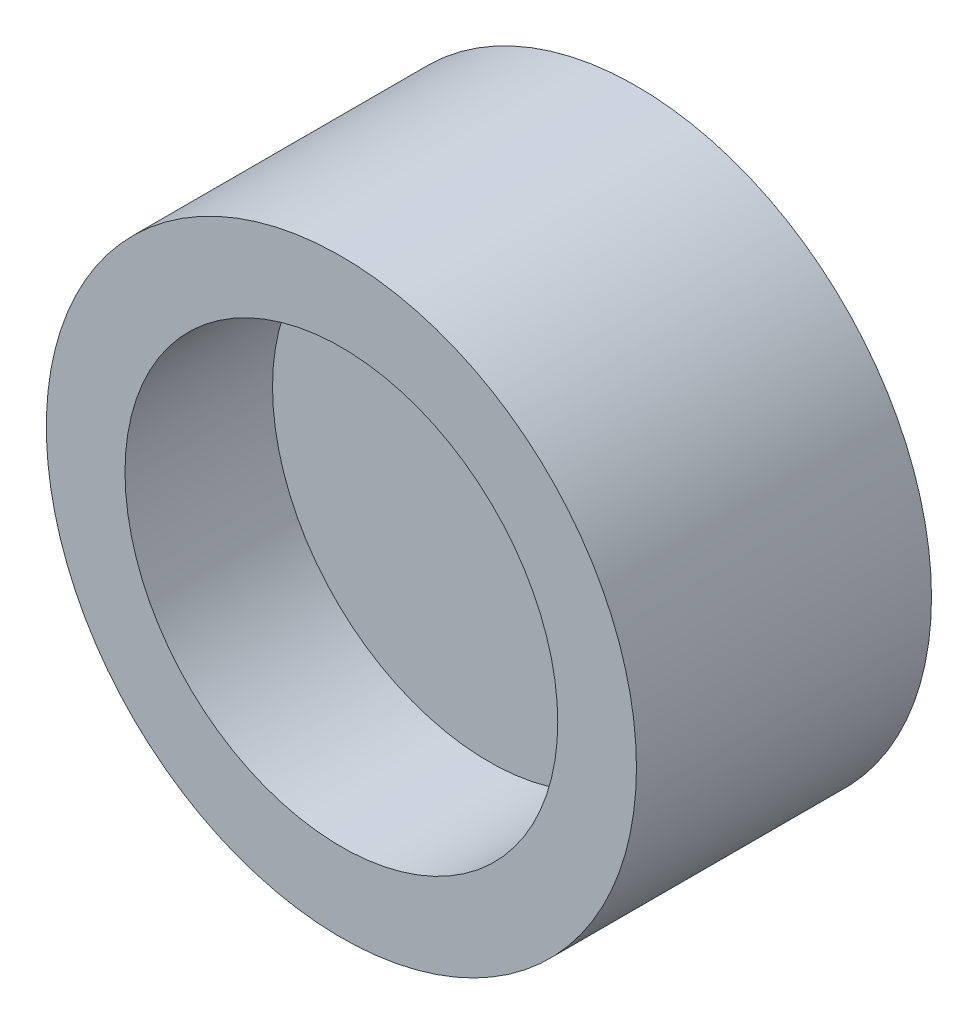
ISO-10303-21;
HEADER;
FILE_DESCRIPTION(('STEP AP214'),'2;1');
FILE_NAME('part.step','',(''),(''),'','','');
FILE_SCHEMA(('AUTOMOTIVE_DESIGN { 1 0 10303 214 1 1 1 1 }'));
ENDSEC;
DATA;
#1=APPLICATION_CONTEXT('core data for automotive mechanical design processes');
#2=APPLICATION_PROTOCOL_DEFINITION('international standard','automotive_design',2000,#1);
#3=PRODUCT_CONTEXT('',#1,'mechanical');
#4=PRODUCT('Part','Part','',(#3));
#5=PRODUCT_RELATED_PRODUCT_CATEGORY('part','',(#4));
#6=PRODUCT_DEFINITION_FORMATION('','',#4);
#7=PRODUCT_DEFINITION_CONTEXT('part definition',#1,'design');
#8=PRODUCT_DEFINITION('design','',#6,#7);
#9=PRODUCT_DEFINITION_SHAPE('','',#8);
#10=(LENGTH_UNIT() NAMED_UNIT(*) SI_UNIT(.MILLI.,.METRE.));
#11=(NAMED_UNIT(*) PLANE_ANGLE_UNIT() SI_UNIT($,.RADIAN.));
#12=(NAMED_UNIT(*) SI_UNIT($,.STERADIAN.) SOLID_ANGLE_UNIT());
#13=UNCERTAINTY_MEASURE_WITH_UNIT(LENGTH_MEASURE(1.E-05),#10,'distance_accuracy_value','');
#14=(GEOMETRIC_REPRESENTATION_CONTEXT(3) GLOBAL_UNCERTAINTY_ASSIGNED_CONTEXT((#13)) GLOBAL_UNIT_ASSIGNED_CONTEXT((#10,
#11,#12)) REPRESENTATION_CONTEXT('',''));
#15=CARTESIAN_POINT('',(0.,0.,0.));
#16=DIRECTION('',(0.,0.,1.));
#17=DIRECTION('',(1.,0.,0.));
#18=AXIS2_PLACEMENT_3D('',#15,#16,#17);
#19=CARTESIAN_POINT('',(0.,0.,3.));
#20=DIRECTION('',(0.,0.,-1.));
#21=DIRECTION('',(-1.,0.,0.));
#22=AXIS2_PLACEMENT_3D('',#19,#20,#21);
#23=CYLINDRICAL_SURFACE('',#22,3.);
#24=CARTESIAN_POINT('',(0.,0.,3.));
#25=DIRECTION('',(0.,0.,1.));
#26=DIRECTION('',(1.,0.,0.));
#27=AXIS2_PLACEMENT_3D('',#24,#25,#26);
#28=CIRCLE('',#27,3.);
#29=CARTESIAN_POINT('',(3.,0.,3.));
#30=VERTEX_POINT('',#29);
#31=EDGE_CURVE('E10',#30,#30,#28,.T.);
#32=ORIENTED_EDGE('',*,*,#31,.F.);
#33=EDGE_LOOP('',(#32));
#34=FACE_BOUND('',#33,.T.);
#35=CARTESIAN_POINT('',(0.,0.,0.));
#36=DIRECTION('',(0.,0.,1.));
#37=DIRECTION('',(1.,0.,0.));
#38=AXIS2_PLACEMENT_3D('',#35,#36,#37);
#39=CIRCLE('',#38,3.);
#40=CARTESIAN_POINT('',(3.,0.,0.));
#41=VERTEX_POINT('',#40);
#42=EDGE_CURVE('E40',#41,#41,#39,.T.);
#43=ORIENTED_EDGE('',*,*,#42,.T.);
#44=EDGE_LOOP('',(#43));
#45=FACE_BOUND('',#44,.T.);
#46=ADVANCED_FACE('F37',(#34,#45),#23,.T.);
#47=CARTESIAN_POINT('',(0.,0.,3.));
#48=DIRECTION('',(0.,0.,1.));
#49=DIRECTION('',(1.,0.,0.));
#50=AXIS2_PLACEMENT_3D('',#47,#48,#49);
#51=PLANE('',#50);
#52=CARTESIAN_POINT('',(0.,0.,3.));
#53=DIRECTION('',(0.,0.,1.));
#54=DIRECTION('',(1.,0.,0.));
#55=AXIS2_PLACEMENT_3D('',#52,#53,#54);
#56=CIRCLE('',#55,2.2);
#57=CARTESIAN_POINT('',(2.2,0.,3.));
#58=VERTEX_POINT('',#57);
#59=EDGE_CURVE('E49',#58,#58,#56,.T.);
#60=ORIENTED_EDGE('',*,*,#59,.F.);
#61=EDGE_LOOP('',(#60));
#62=FACE_BOUND('',#61,.T.);
#63=ORIENTED_EDGE('',*,*,#31,.T.);
#64=EDGE_LOOP('',(#63));
#65=FACE_BOUND('',#64,.T.);
#66=ADVANCED_FACE('F64',(#62,#65),#51,.T.);
#67=CARTESIAN_POINT('',(0.,0.,0.));
#68=DIRECTION('',(0.,0.,1.));
#69=DIRECTION('',(1.,0.,0.));
#70=AXIS2_PLACEMENT_3D('',#67,#68,#69);
#71=PLANE('',#70);
#72=ORIENTED_EDGE('',*,*,#42,.F.);
#73=EDGE_LOOP('',(#72));
#74=FACE_BOUND('',#73,.T.);
#75=ADVANCED_FACE('F60',(#74),#71,.F.);
#76=CARTESIAN_POINT('',(0.,0.,1.5));
#77=DIRECTION('',(0.,0.,1.));
#78=DIRECTION('',(1.,0.,0.));
#79=AXIS2_PLACEMENT_3D('',#76,#77,#78);
#80=CYLINDRICAL_SURFACE('',#79,2.2);
#81=CARTESIAN_POINT('',(0.,0.,1.5));
#82=DIRECTION('',(0.,0.,1.));
#83=DIRECTION('',(1.,0.,0.));
#84=AXIS2_PLACEMENT_3D('',#81,#82,#83);
#85=CIRCLE('',#84,2.2);
#86=CARTESIAN_POINT('',(2.2,0.,1.5));
#87=VERTEX_POINT('',#86);
#88=EDGE_CURVE('E47',#87,#87,#85,.T.);
#89=ORIENTED_EDGE('',*,*,#88,.F.);
#90=EDGE_LOOP('',(#89));
#91=FACE_BOUND('',#90,.T.);
#92=ORIENTED_EDGE('',*,*,#59,.T.);
#93=EDGE_LOOP('',(#92));
#94=FACE_BOUND('',#93,.T.);
#95=ADVANCED_FACE('F57',(#91,#94),#80,.F.);
#96=CARTESIAN_POINT('',(0.,0.,1.5));
#97=DIRECTION('',(0.,0.,1.));
#98=DIRECTION('',(1.,0.,0.));
#99=AXIS2_PLACEMENT_3D('',#96,#97,#98);
#100=PLANE('',#99);
#101=ORIENTED_EDGE('',*,*,#88,.T.);
#102=EDGE_LOOP('',(#101));
#103=FACE_BOUND('',#102,.T.);
#104=ADVANCED_FACE('F55',(#103),#100,.T.);
#105=CLOSED_SHELL('',(#46,#66,#75,#95,#104));
#106=MANIFOLD_SOLID_BREP('B2',#105);
#107=ADVANCED_BREP_SHAPE_REPRESENTATION('',(#18,#106),#14);
#108=SHAPE_DEFINITION_REPRESENTATION(#9,#107);
ENDSEC;
END-ISO-10303-21;
